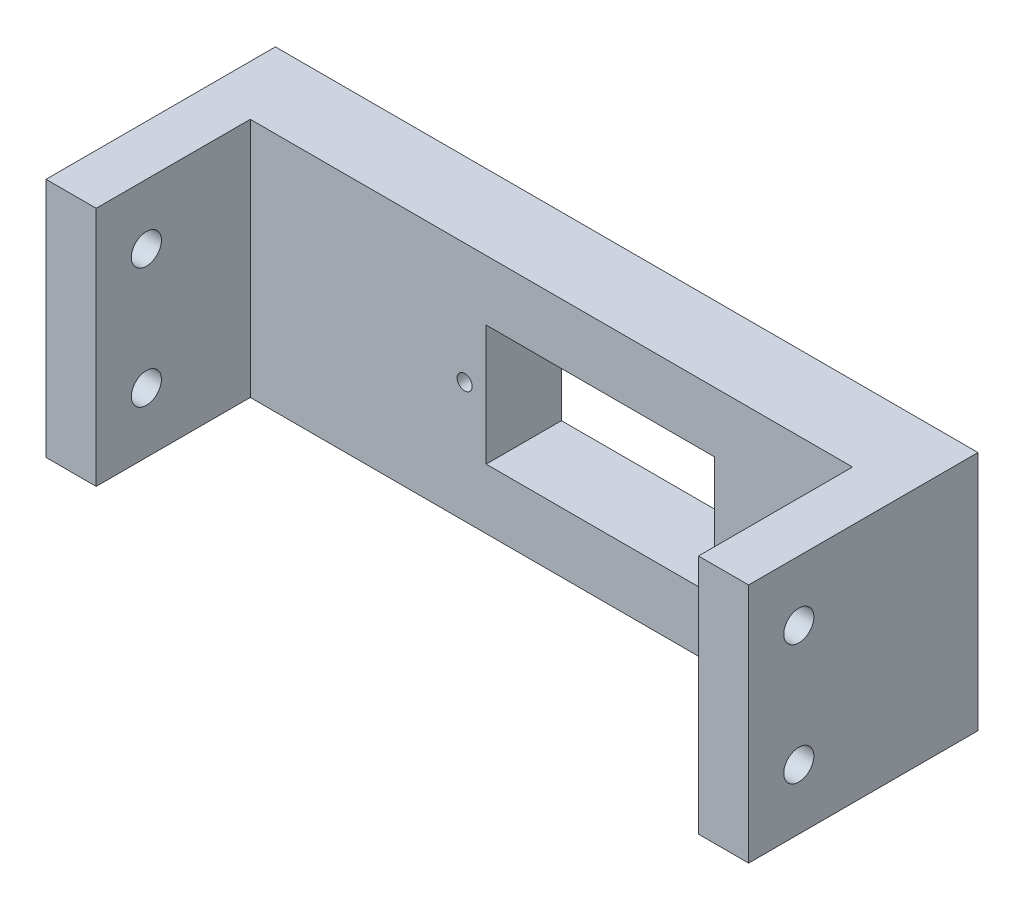
ISO-10303-21;
HEADER;
FILE_DESCRIPTION(('STEP AP214'),'2;1');
FILE_NAME('part.step','',(''),(''),'','','');
FILE_SCHEMA(('AUTOMOTIVE_DESIGN { 1 0 10303 214 1 1 1 1 }'));
ENDSEC;
DATA;
#1=APPLICATION_CONTEXT('core data for automotive mechanical design processes');
#2=APPLICATION_PROTOCOL_DEFINITION('international standard','automotive_design',2000,#1);
#3=PRODUCT_CONTEXT('',#1,'mechanical');
#4=PRODUCT('Part','Part','',(#3));
#5=PRODUCT_RELATED_PRODUCT_CATEGORY('part','',(#4));
#6=PRODUCT_DEFINITION_FORMATION('','',#4);
#7=PRODUCT_DEFINITION_CONTEXT('part definition',#1,'design');
#8=PRODUCT_DEFINITION('design','',#6,#7);
#9=PRODUCT_DEFINITION_SHAPE('','',#8);
#10=(LENGTH_UNIT() NAMED_UNIT(*) SI_UNIT(.MILLI.,.METRE.));
#11=(NAMED_UNIT(*) PLANE_ANGLE_UNIT() SI_UNIT($,.RADIAN.));
#12=(NAMED_UNIT(*) SI_UNIT($,.STERADIAN.) SOLID_ANGLE_UNIT());
#13=UNCERTAINTY_MEASURE_WITH_UNIT(LENGTH_MEASURE(1.E-05),#10,'distance_accuracy_value','');
#14=(GEOMETRIC_REPRESENTATION_CONTEXT(3) GLOBAL_UNCERTAINTY_ASSIGNED_CONTEXT((#13)) GLOBAL_UNIT_ASSIGNED_CONTEXT((#10,
#11,#12)) REPRESENTATION_CONTEXT('',''));
#15=CARTESIAN_POINT('',(0.,0.,0.));
#16=DIRECTION('',(0.,0.,1.));
#17=DIRECTION('',(1.,0.,0.));
#18=AXIS2_PLACEMENT_3D('',#15,#16,#17);
#19=CARTESIAN_POINT('',(-30.,24.,0.));
#20=DIRECTION('',(1.,0.,0.));
#21=DIRECTION('',(0.,0.,-1.));
#22=AXIS2_PLACEMENT_3D('',#19,#20,#21);
#23=PLANE('',#22);
#24=CARTESIAN_POINT('',(-30.,18.,14.1));
#25=DIRECTION('',(1.,0.,0.));
#26=DIRECTION('',(0.,0.,-1.));
#27=AXIS2_PLACEMENT_3D('',#24,#25,#26);
#28=CIRCLE('',#27,1.5);
#29=CARTESIAN_POINT('',(-30.,18.,12.6));
#30=VERTEX_POINT('',#29);
#31=EDGE_CURVE('E206',#30,#30,#28,.T.);
#32=ORIENTED_EDGE('',*,*,#31,.F.);
#33=EDGE_LOOP('',(#32));
#34=FACE_BOUND('',#33,.T.);
#35=CARTESIAN_POINT('',(-30.,6.,14.1));
#36=DIRECTION('',(1.,0.,0.));
#37=DIRECTION('',(0.,0.,-1.));
#38=AXIS2_PLACEMENT_3D('',#35,#36,#37);
#39=CIRCLE('',#38,1.5);
#40=CARTESIAN_POINT('',(-30.,6.,12.6));
#41=VERTEX_POINT('',#40);
#42=EDGE_CURVE('E198',#41,#41,#39,.T.);
#43=ORIENTED_EDGE('',*,*,#42,.F.);
#44=EDGE_LOOP('',(#43));
#45=FACE_BOUND('',#44,.T.);
#46=DIRECTION('',(0.,0.,1.));
#47=VECTOR('',#46,1.);
#48=CARTESIAN_POINT('',(-30.,0.,0.));
#49=LINE('',#48,#47);
#50=CARTESIAN_POINT('',(-30.,0.,3.74999999999998));
#51=VERTEX_POINT('',#50);
#52=CARTESIAN_POINT('',(-30.,0.,19.1));
#53=VERTEX_POINT('',#52);
#54=EDGE_CURVE('E210',#51,#53,#49,.T.);
#55=ORIENTED_EDGE('',*,*,#54,.F.);
#56=DIRECTION('',(0.,-1.,0.));
#57=VECTOR('',#56,1.);
#58=CARTESIAN_POINT('',(-30.,24.,3.74999999999998));
#59=LINE('',#58,#57);
#60=CARTESIAN_POINT('',(-30.,24.,3.74999999999998));
#61=VERTEX_POINT('',#60);
#62=EDGE_CURVE('E11',#61,#51,#59,.T.);
#63=ORIENTED_EDGE('',*,*,#62,.F.);
#64=DIRECTION('',(0.,0.,1.));
#65=VECTOR('',#64,1.);
#66=CARTESIAN_POINT('',(-30.,24.,0.));
#67=LINE('',#66,#65);
#68=CARTESIAN_POINT('',(-30.,24.,19.1));
#69=VERTEX_POINT('',#68);
#70=EDGE_CURVE('E211',#61,#69,#67,.T.);
#71=ORIENTED_EDGE('',*,*,#70,.T.);
#72=DIRECTION('',(0.,-1.,0.));
#73=VECTOR('',#72,1.);
#74=CARTESIAN_POINT('',(-30.,24.,19.1));
#75=LINE('',#74,#73);
#76=EDGE_CURVE('E240',#69,#53,#75,.T.);
#77=ORIENTED_EDGE('',*,*,#76,.T.);
#78=EDGE_LOOP('',(#55,#63,#71,#77));
#79=FACE_BOUND('',#78,.T.);
#80=ADVANCED_FACE('F43',(#34,#45,#79),#23,.T.);
#81=CARTESIAN_POINT('',(0.,24.,3.74999999999999));
#82=DIRECTION('',(0.,0.,-1.));
#83=DIRECTION('',(-1.,0.,0.));
#84=AXIS2_PLACEMENT_3D('',#81,#82,#83);
#85=PLANE('',#84);
#86=CARTESIAN_POINT('',(19.16,12.,3.74999999999999));
#87=DIRECTION('',(0.,0.,-1.));
#88=DIRECTION('',(-1.,0.,0.));
#89=AXIS2_PLACEMENT_3D('',#86,#87,#88);
#90=CIRCLE('',#89,0.750000000000002);
#91=CARTESIAN_POINT('',(18.41,12.,3.74999999999999));
#92=VERTEX_POINT('',#91);
#93=EDGE_CURVE('E389',#92,#92,#90,.T.);
#94=ORIENTED_EDGE('',*,*,#93,.T.);
#95=EDGE_LOOP('',(#94));
#96=FACE_BOUND('',#95,.T.);
#97=CARTESIAN_POINT('',(-8.64,12.,3.74999999999999));
#98=DIRECTION('',(0.,0.,-1.));
#99=DIRECTION('',(-1.,0.,0.));
#100=AXIS2_PLACEMENT_3D('',#97,#98,#99);
#101=CIRCLE('',#100,0.75);
#102=CARTESIAN_POINT('',(-9.39,12.,3.74999999999999));
#103=VERTEX_POINT('',#102);
#104=EDGE_CURVE('E391',#103,#103,#101,.T.);
#105=ORIENTED_EDGE('',*,*,#104,.T.);
#106=EDGE_LOOP('',(#105));
#107=FACE_BOUND('',#106,.T.);
#108=DIRECTION('',(1.,0.,0.));
#109=VECTOR('',#108,1.);
#110=CARTESIAN_POINT('',(-6.49999999999999,6.,3.74999999999999));
#111=LINE('',#110,#109);
#112=CARTESIAN_POINT('',(-6.5,6.,3.74999999999999));
#113=VERTEX_POINT('',#112);
#114=CARTESIAN_POINT('',(16.25,6.,3.74999999999999));
#115=VERTEX_POINT('',#114);
#116=EDGE_CURVE('E153',#113,#115,#111,.T.);
#117=ORIENTED_EDGE('',*,*,#116,.F.);
#118=DIRECTION('',(0.,-1.,0.));
#119=VECTOR('',#118,1.);
#120=CARTESIAN_POINT('',(-6.5,18.,3.74999999999999));
#121=LINE('',#120,#119);
#122=CARTESIAN_POINT('',(-6.5,18.,3.74999999999999));
#123=VERTEX_POINT('',#122);
#124=EDGE_CURVE('E133',#123,#113,#121,.T.);
#125=ORIENTED_EDGE('',*,*,#124,.F.);
#126=DIRECTION('',(-1.,0.,0.));
#127=VECTOR('',#126,1.);
#128=CARTESIAN_POINT('',(-6.49999999999999,18.,3.74999999999999));
#129=LINE('',#128,#127);
#130=CARTESIAN_POINT('',(16.25,18.,3.74999999999999));
#131=VERTEX_POINT('',#130);
#132=EDGE_CURVE('E143',#131,#123,#129,.T.);
#133=ORIENTED_EDGE('',*,*,#132,.F.);
#134=DIRECTION('',(0.,1.,0.));
#135=VECTOR('',#134,1.);
#136=CARTESIAN_POINT('',(16.25,18.,3.74999999999999));
#137=LINE('',#136,#135);
#138=EDGE_CURVE('E58',#115,#131,#137,.T.);
#139=ORIENTED_EDGE('',*,*,#138,.F.);
#140=EDGE_LOOP('',(#117,#125,#133,#139));
#141=FACE_BOUND('',#140,.T.);
#142=DIRECTION('',(1.,0.,0.));
#143=VECTOR('',#142,1.);
#144=CARTESIAN_POINT('',(0.,0.,3.74999999999999));
#145=LINE('',#144,#143);
#146=CARTESIAN_POINT('',(30.,0.,3.75));
#147=VERTEX_POINT('',#146);
#148=EDGE_CURVE('E244',#51,#147,#145,.T.);
#149=ORIENTED_EDGE('',*,*,#148,.T.);
#150=DIRECTION('',(0.,-1.,0.));
#151=VECTOR('',#150,1.);
#152=CARTESIAN_POINT('',(30.,24.,3.75));
#153=LINE('',#152,#151);
#154=CARTESIAN_POINT('',(30.,24.,3.75));
#155=VERTEX_POINT('',#154);
#156=EDGE_CURVE('E51',#155,#147,#153,.T.);
#157=ORIENTED_EDGE('',*,*,#156,.F.);
#158=DIRECTION('',(1.,0.,0.));
#159=VECTOR('',#158,1.);
#160=CARTESIAN_POINT('',(0.,24.,3.74999999999999));
#161=LINE('',#160,#159);
#162=EDGE_CURVE('E215',#61,#155,#161,.T.);
#163=ORIENTED_EDGE('',*,*,#162,.F.);
#164=ORIENTED_EDGE('',*,*,#62,.T.);
#165=EDGE_LOOP('',(#149,#157,#163,#164));
#166=FACE_BOUND('',#165,.T.);
#167=ADVANCED_FACE('F150',(#96,#107,#141,#166),#85,.F.);
#168=CARTESIAN_POINT('',(30.,24.,0.));
#169=DIRECTION('',(1.,0.,0.));
#170=DIRECTION('',(0.,0.,-1.));
#171=AXIS2_PLACEMENT_3D('',#168,#169,#170);
#172=PLANE('',#171);
#173=CARTESIAN_POINT('',(30.,18.,14.1));
#174=DIRECTION('',(1.,0.,0.));
#175=DIRECTION('',(0.,0.,-1.));
#176=AXIS2_PLACEMENT_3D('',#173,#174,#175);
#177=CIRCLE('',#176,1.5);
#178=CARTESIAN_POINT('',(30.,18.,12.6));
#179=VERTEX_POINT('',#178);
#180=EDGE_CURVE('E202',#179,#179,#177,.T.);
#181=ORIENTED_EDGE('',*,*,#180,.T.);
#182=EDGE_LOOP('',(#181));
#183=FACE_BOUND('',#182,.T.);
#184=CARTESIAN_POINT('',(30.,6.,14.1));
#185=DIRECTION('',(1.,0.,0.));
#186=DIRECTION('',(0.,0.,-1.));
#187=AXIS2_PLACEMENT_3D('',#184,#185,#186);
#188=CIRCLE('',#187,1.5);
#189=CARTESIAN_POINT('',(30.,6.,12.6));
#190=VERTEX_POINT('',#189);
#191=EDGE_CURVE('E183',#190,#190,#188,.T.);
#192=ORIENTED_EDGE('',*,*,#191,.T.);
#193=EDGE_LOOP('',(#192));
#194=FACE_BOUND('',#193,.T.);
#195=DIRECTION('',(0.,0.,1.));
#196=VECTOR('',#195,1.);
#197=CARTESIAN_POINT('',(30.,0.,0.));
#198=LINE('',#197,#196);
#199=CARTESIAN_POINT('',(30.,0.,19.1));
#200=VERTEX_POINT('',#199);
#201=EDGE_CURVE('E247',#147,#200,#198,.T.);
#202=ORIENTED_EDGE('',*,*,#201,.T.);
#203=DIRECTION('',(0.,-1.,0.));
#204=VECTOR('',#203,1.);
#205=CARTESIAN_POINT('',(30.,24.,19.1));
#206=LINE('',#205,#204);
#207=CARTESIAN_POINT('',(30.,24.,19.1));
#208=VERTEX_POINT('',#207);
#209=EDGE_CURVE('E284',#208,#200,#206,.T.);
#210=ORIENTED_EDGE('',*,*,#209,.F.);
#211=DIRECTION('',(0.,0.,1.));
#212=VECTOR('',#211,1.);
#213=CARTESIAN_POINT('',(30.,24.,0.));
#214=LINE('',#213,#212);
#215=EDGE_CURVE('E219',#155,#208,#214,.T.);
#216=ORIENTED_EDGE('',*,*,#215,.F.);
#217=ORIENTED_EDGE('',*,*,#156,.T.);
#218=EDGE_LOOP('',(#202,#210,#216,#217));
#219=FACE_BOUND('',#218,.T.);
#220=ADVANCED_FACE('F292',(#183,#194,#219),#172,.F.);
#221=CARTESIAN_POINT('',(0.,24.,19.1));
#222=DIRECTION('',(0.,0.,1.));
#223=DIRECTION('',(1.,0.,0.));
#224=AXIS2_PLACEMENT_3D('',#221,#222,#223);
#225=PLANE('',#224);
#226=DIRECTION('',(-1.,0.,0.));
#227=VECTOR('',#226,1.);
#228=CARTESIAN_POINT('',(0.,0.,19.1));
#229=LINE('',#228,#227);
#230=CARTESIAN_POINT('',(35.,0.,19.1));
#231=VERTEX_POINT('',#230);
#232=EDGE_CURVE('E251',#231,#200,#229,.T.);
#233=ORIENTED_EDGE('',*,*,#232,.F.);
#234=DIRECTION('',(0.,-1.,0.));
#235=VECTOR('',#234,1.);
#236=CARTESIAN_POINT('',(35.,24.,19.1));
#237=LINE('',#236,#235);
#238=CARTESIAN_POINT('',(35.,24.,19.1));
#239=VERTEX_POINT('',#238);
#240=EDGE_CURVE('E281',#239,#231,#237,.T.);
#241=ORIENTED_EDGE('',*,*,#240,.F.);
#242=DIRECTION('',(-1.,0.,0.));
#243=VECTOR('',#242,1.);
#244=CARTESIAN_POINT('',(0.,24.,19.1));
#245=LINE('',#244,#243);
#246=EDGE_CURVE('E222',#239,#208,#245,.T.);
#247=ORIENTED_EDGE('',*,*,#246,.T.);
#248=ORIENTED_EDGE('',*,*,#209,.T.);
#249=EDGE_LOOP('',(#233,#241,#247,#248));
#250=FACE_BOUND('',#249,.T.);
#251=ADVANCED_FACE('F302',(#250),#225,.T.);
#252=CARTESIAN_POINT('',(35.,24.,0.));
#253=DIRECTION('',(1.,0.,0.));
#254=DIRECTION('',(0.,0.,-1.));
#255=AXIS2_PLACEMENT_3D('',#252,#253,#254);
#256=PLANE('',#255);
#257=CARTESIAN_POINT('',(35.,18.,14.1));
#258=DIRECTION('',(-1.,0.,0.));
#259=DIRECTION('',(0.,0.,1.));
#260=AXIS2_PLACEMENT_3D('',#257,#258,#259);
#261=CIRCLE('',#260,1.5);
#262=CARTESIAN_POINT('',(35.,18.,15.6));
#263=VERTEX_POINT('',#262);
#264=EDGE_CURVE('E179',#263,#263,#261,.T.);
#265=ORIENTED_EDGE('',*,*,#264,.T.);
#266=EDGE_LOOP('',(#265));
#267=FACE_BOUND('',#266,.T.);
#268=CARTESIAN_POINT('',(35.,6.,14.1));
#269=DIRECTION('',(-1.,0.,0.));
#270=DIRECTION('',(0.,0.,1.));
#271=AXIS2_PLACEMENT_3D('',#268,#269,#270);
#272=CIRCLE('',#271,1.5);
#273=CARTESIAN_POINT('',(35.,6.,15.6));
#274=VERTEX_POINT('',#273);
#275=EDGE_CURVE('E188',#274,#274,#272,.T.);
#276=ORIENTED_EDGE('',*,*,#275,.T.);
#277=EDGE_LOOP('',(#276));
#278=FACE_BOUND('',#277,.T.);
#279=DIRECTION('',(0.,0.,1.));
#280=VECTOR('',#279,1.);
#281=CARTESIAN_POINT('',(35.,0.,0.));
#282=LINE('',#281,#280);
#283=CARTESIAN_POINT('',(35.,0.,-3.75));
#284=VERTEX_POINT('',#283);
#285=EDGE_CURVE('E255',#284,#231,#282,.T.);
#286=ORIENTED_EDGE('',*,*,#285,.F.);
#287=DIRECTION('',(0.,-1.,0.));
#288=VECTOR('',#287,1.);
#289=CARTESIAN_POINT('',(35.,24.,-3.75));
#290=LINE('',#289,#288);
#291=CARTESIAN_POINT('',(35.,24.,-3.75));
#292=VERTEX_POINT('',#291);
#293=EDGE_CURVE('E278',#292,#284,#290,.T.);
#294=ORIENTED_EDGE('',*,*,#293,.F.);
#295=DIRECTION('',(0.,0.,1.));
#296=VECTOR('',#295,1.);
#297=CARTESIAN_POINT('',(35.,24.,0.));
#298=LINE('',#297,#296);
#299=EDGE_CURVE('E226',#292,#239,#298,.T.);
#300=ORIENTED_EDGE('',*,*,#299,.T.);
#301=ORIENTED_EDGE('',*,*,#240,.T.);
#302=EDGE_LOOP('',(#286,#294,#300,#301));
#303=FACE_BOUND('',#302,.T.);
#304=ADVANCED_FACE('F310',(#267,#278,#303),#256,.T.);
#305=CARTESIAN_POINT('',(0.,24.,-3.74999999999999));
#306=DIRECTION('',(0.,0.,-1.));
#307=DIRECTION('',(-1.,0.,0.));
#308=AXIS2_PLACEMENT_3D('',#305,#306,#307);
#309=PLANE('',#308);
#310=CARTESIAN_POINT('',(19.16,12.,-3.75));
#311=DIRECTION('',(0.,0.,-1.));
#312=DIRECTION('',(-1.,0.,0.));
#313=AXIS2_PLACEMENT_3D('',#310,#311,#312);
#314=CIRCLE('',#313,0.750000000000002);
#315=CARTESIAN_POINT('',(18.41,12.,-3.74999999999999));
#316=VERTEX_POINT('',#315);
#317=EDGE_CURVE('E387',#316,#316,#314,.T.);
#318=ORIENTED_EDGE('',*,*,#317,.F.);
#319=EDGE_LOOP('',(#318));
#320=FACE_BOUND('',#319,.T.);
#321=CARTESIAN_POINT('',(-8.64,12.,-3.74999999999999));
#322=DIRECTION('',(0.,0.,-1.));
#323=DIRECTION('',(-1.,0.,0.));
#324=AXIS2_PLACEMENT_3D('',#321,#322,#323);
#325=CIRCLE('',#324,0.75);
#326=CARTESIAN_POINT('',(-9.39,12.,-3.74999999999999));
#327=VERTEX_POINT('',#326);
#328=EDGE_CURVE('E398',#327,#327,#325,.T.);
#329=ORIENTED_EDGE('',*,*,#328,.F.);
#330=EDGE_LOOP('',(#329));
#331=FACE_BOUND('',#330,.T.);
#332=DIRECTION('',(0.,1.,0.));
#333=VECTOR('',#332,1.);
#334=CARTESIAN_POINT('',(-6.5,18.,-3.74999999999999));
#335=LINE('',#334,#333);
#336=CARTESIAN_POINT('',(-6.5,6.,-3.74999999999999));
#337=VERTEX_POINT('',#336);
#338=CARTESIAN_POINT('',(-6.5,18.,-3.74999999999999));
#339=VERTEX_POINT('',#338);
#340=EDGE_CURVE('E66',#337,#339,#335,.T.);
#341=ORIENTED_EDGE('',*,*,#340,.F.);
#342=DIRECTION('',(-1.,0.,0.));
#343=VECTOR('',#342,1.);
#344=CARTESIAN_POINT('',(-6.5,6.,-3.74999999999999));
#345=LINE('',#344,#343);
#346=CARTESIAN_POINT('',(16.25,6.,-3.74999999999999));
#347=VERTEX_POINT('',#346);
#348=EDGE_CURVE('E140',#347,#337,#345,.T.);
#349=ORIENTED_EDGE('',*,*,#348,.F.);
#350=DIRECTION('',(0.,-1.,0.));
#351=VECTOR('',#350,1.);
#352=CARTESIAN_POINT('',(16.25,18.,-3.74999999999999));
#353=LINE('',#352,#351);
#354=CARTESIAN_POINT('',(16.25,18.,-3.74999999999999));
#355=VERTEX_POINT('',#354);
#356=EDGE_CURVE('E165',#355,#347,#353,.T.);
#357=ORIENTED_EDGE('',*,*,#356,.F.);
#358=DIRECTION('',(1.,0.,0.));
#359=VECTOR('',#358,1.);
#360=CARTESIAN_POINT('',(-6.5,18.,-3.74999999999999));
#361=LINE('',#360,#359);
#362=EDGE_CURVE('E158',#339,#355,#361,.T.);
#363=ORIENTED_EDGE('',*,*,#362,.F.);
#364=EDGE_LOOP('',(#341,#349,#357,#363));
#365=FACE_BOUND('',#364,.T.);
#366=DIRECTION('',(1.,0.,0.));
#367=VECTOR('',#366,1.);
#368=CARTESIAN_POINT('',(0.,0.,-3.74999999999999));
#369=LINE('',#368,#367);
#370=CARTESIAN_POINT('',(-35.,0.,-3.74999999999998));
#371=VERTEX_POINT('',#370);
#372=EDGE_CURVE('E259',#371,#284,#369,.T.);
#373=ORIENTED_EDGE('',*,*,#372,.F.);
#374=DIRECTION('',(0.,-1.,0.));
#375=VECTOR('',#374,1.);
#376=CARTESIAN_POINT('',(-35.,24.,-3.74999999999998));
#377=LINE('',#376,#375);
#378=CARTESIAN_POINT('',(-35.,24.,-3.74999999999998));
#379=VERTEX_POINT('',#378);
#380=EDGE_CURVE('E275',#379,#371,#377,.T.);
#381=ORIENTED_EDGE('',*,*,#380,.F.);
#382=DIRECTION('',(1.,0.,0.));
#383=VECTOR('',#382,1.);
#384=CARTESIAN_POINT('',(0.,24.,-3.74999999999999));
#385=LINE('',#384,#383);
#386=EDGE_CURVE('E230',#379,#292,#385,.T.);
#387=ORIENTED_EDGE('',*,*,#386,.T.);
#388=ORIENTED_EDGE('',*,*,#293,.T.);
#389=EDGE_LOOP('',(#373,#381,#387,#388));
#390=FACE_BOUND('',#389,.T.);
#391=ADVANCED_FACE('F313',(#320,#331,#365,#390),#309,.T.);
#392=CARTESIAN_POINT('',(-35.,24.,0.));
#393=DIRECTION('',(1.,0.,0.));
#394=DIRECTION('',(0.,0.,-1.));
#395=AXIS2_PLACEMENT_3D('',#392,#393,#394);
#396=PLANE('',#395);
#397=CARTESIAN_POINT('',(-35.,18.,14.1));
#398=DIRECTION('',(-1.,0.,0.));
#399=DIRECTION('',(0.,0.,1.));
#400=AXIS2_PLACEMENT_3D('',#397,#398,#399);
#401=CIRCLE('',#400,1.5);
#402=CARTESIAN_POINT('',(-35.,18.,15.6));
#403=VERTEX_POINT('',#402);
#404=EDGE_CURVE('E184',#403,#403,#401,.T.);
#405=ORIENTED_EDGE('',*,*,#404,.F.);
#406=EDGE_LOOP('',(#405));
#407=FACE_BOUND('',#406,.T.);
#408=CARTESIAN_POINT('',(-35.,6.,14.1));
#409=DIRECTION('',(-1.,0.,0.));
#410=DIRECTION('',(0.,0.,1.));
#411=AXIS2_PLACEMENT_3D('',#408,#409,#410);
#412=CIRCLE('',#411,1.5);
#413=CARTESIAN_POINT('',(-35.,6.,15.6));
#414=VERTEX_POINT('',#413);
#415=EDGE_CURVE('E147',#414,#414,#412,.T.);
#416=ORIENTED_EDGE('',*,*,#415,.F.);
#417=EDGE_LOOP('',(#416));
#418=FACE_BOUND('',#417,.T.);
#419=DIRECTION('',(0.,0.,1.));
#420=VECTOR('',#419,1.);
#421=CARTESIAN_POINT('',(-35.,0.,0.));
#422=LINE('',#421,#420);
#423=CARTESIAN_POINT('',(-35.,0.,19.1));
#424=VERTEX_POINT('',#423);
#425=EDGE_CURVE('E263',#371,#424,#422,.T.);
#426=ORIENTED_EDGE('',*,*,#425,.T.);
#427=DIRECTION('',(0.,-1.,0.));
#428=VECTOR('',#427,1.);
#429=CARTESIAN_POINT('',(-35.,24.,19.1));
#430=LINE('',#429,#428);
#431=CARTESIAN_POINT('',(-35.,24.,19.1));
#432=VERTEX_POINT('',#431);
#433=EDGE_CURVE('E271',#432,#424,#430,.T.);
#434=ORIENTED_EDGE('',*,*,#433,.F.);
#435=DIRECTION('',(0.,0.,1.));
#436=VECTOR('',#435,1.);
#437=CARTESIAN_POINT('',(-35.,24.,0.));
#438=LINE('',#437,#436);
#439=EDGE_CURVE('E234',#379,#432,#438,.T.);
#440=ORIENTED_EDGE('',*,*,#439,.F.);
#441=ORIENTED_EDGE('',*,*,#380,.T.);
#442=EDGE_LOOP('',(#426,#434,#440,#441));
#443=FACE_BOUND('',#442,.T.);
#444=ADVANCED_FACE('F319',(#407,#418,#443),#396,.F.);
#445=CARTESIAN_POINT('',(0.,24.,19.1));
#446=DIRECTION('',(0.,0.,-1.));
#447=DIRECTION('',(-1.,0.,0.));
#448=AXIS2_PLACEMENT_3D('',#445,#446,#447);
#449=PLANE('',#448);
#450=DIRECTION('',(1.,0.,0.));
#451=VECTOR('',#450,1.);
#452=CARTESIAN_POINT('',(0.,0.,19.1));
#453=LINE('',#452,#451);
#454=EDGE_CURVE('E216',#424,#53,#453,.T.);
#455=ORIENTED_EDGE('',*,*,#454,.T.);
#456=ORIENTED_EDGE('',*,*,#76,.F.);
#457=DIRECTION('',(1.,0.,0.));
#458=VECTOR('',#457,1.);
#459=CARTESIAN_POINT('',(0.,24.,19.1));
#460=LINE('',#459,#458);
#461=EDGE_CURVE('E237',#432,#69,#460,.T.);
#462=ORIENTED_EDGE('',*,*,#461,.F.);
#463=ORIENTED_EDGE('',*,*,#433,.T.);
#464=EDGE_LOOP('',(#455,#456,#462,#463));
#465=FACE_BOUND('',#464,.T.);
#466=ADVANCED_FACE('F323',(#465),#449,.F.);
#467=CARTESIAN_POINT('',(0.,24.,0.));
#468=DIRECTION('',(0.,1.,0.));
#469=DIRECTION('',(0.,0.,1.));
#470=AXIS2_PLACEMENT_3D('',#467,#468,#469);
#471=PLANE('',#470);
#472=ORIENTED_EDGE('',*,*,#70,.F.);
#473=ORIENTED_EDGE('',*,*,#162,.T.);
#474=ORIENTED_EDGE('',*,*,#215,.T.);
#475=ORIENTED_EDGE('',*,*,#246,.F.);
#476=ORIENTED_EDGE('',*,*,#299,.F.);
#477=ORIENTED_EDGE('',*,*,#386,.F.);
#478=ORIENTED_EDGE('',*,*,#439,.T.);
#479=ORIENTED_EDGE('',*,*,#461,.T.);
#480=EDGE_LOOP('',(#472,#473,#474,#475,#476,#477,#478,#479));
#481=FACE_BOUND('',#480,.T.);
#482=ADVANCED_FACE('F307',(#481),#471,.T.);
#483=CARTESIAN_POINT('',(0.,0.,0.));
#484=DIRECTION('',(0.,1.,0.));
#485=DIRECTION('',(0.,0.,1.));
#486=AXIS2_PLACEMENT_3D('',#483,#484,#485);
#487=PLANE('',#486);
#488=ORIENTED_EDGE('',*,*,#54,.T.);
#489=ORIENTED_EDGE('',*,*,#454,.F.);
#490=ORIENTED_EDGE('',*,*,#425,.F.);
#491=ORIENTED_EDGE('',*,*,#372,.T.);
#492=ORIENTED_EDGE('',*,*,#285,.T.);
#493=ORIENTED_EDGE('',*,*,#232,.T.);
#494=ORIENTED_EDGE('',*,*,#201,.F.);
#495=ORIENTED_EDGE('',*,*,#148,.F.);
#496=EDGE_LOOP('',(#488,#489,#490,#491,#492,#493,#494,#495));
#497=FACE_BOUND('',#496,.T.);
#498=ADVANCED_FACE('F297',(#497),#487,.F.);
#499=CARTESIAN_POINT('',(35.,6.,14.1));
#500=DIRECTION('',(-1.,0.,0.));
#501=DIRECTION('',(0.,0.,1.));
#502=AXIS2_PLACEMENT_3D('',#499,#500,#501);
#503=CYLINDRICAL_SURFACE('',#502,1.5);
#504=ORIENTED_EDGE('',*,*,#42,.T.);
#505=EDGE_LOOP('',(#504));
#506=FACE_BOUND('',#505,.T.);
#507=ORIENTED_EDGE('',*,*,#415,.T.);
#508=EDGE_LOOP('',(#507));
#509=FACE_BOUND('',#508,.T.);
#510=ADVANCED_FACE('F352',(#506,#509),#503,.F.);
#511=CARTESIAN_POINT('',(35.,18.,14.1));
#512=DIRECTION('',(-1.,0.,0.));
#513=DIRECTION('',(0.,0.,1.));
#514=AXIS2_PLACEMENT_3D('',#511,#512,#513);
#515=CYLINDRICAL_SURFACE('',#514,1.5);
#516=ORIENTED_EDGE('',*,*,#31,.T.);
#517=EDGE_LOOP('',(#516));
#518=FACE_BOUND('',#517,.T.);
#519=ORIENTED_EDGE('',*,*,#404,.T.);
#520=EDGE_LOOP('',(#519));
#521=FACE_BOUND('',#520,.T.);
#522=ADVANCED_FACE('F357',(#518,#521),#515,.F.);
#523=ORIENTED_EDGE('',*,*,#275,.F.);
#524=EDGE_LOOP('',(#523));
#525=FACE_BOUND('',#524,.T.);
#526=ORIENTED_EDGE('',*,*,#191,.F.);
#527=EDGE_LOOP('',(#526));
#528=FACE_BOUND('',#527,.T.);
#529=ADVANCED_FACE('F359',(#525,#528),#503,.F.);
#530=ORIENTED_EDGE('',*,*,#264,.F.);
#531=EDGE_LOOP('',(#530));
#532=FACE_BOUND('',#531,.T.);
#533=ORIENTED_EDGE('',*,*,#180,.F.);
#534=EDGE_LOOP('',(#533));
#535=FACE_BOUND('',#534,.T.);
#536=ADVANCED_FACE('F363',(#532,#535),#515,.F.);
#537=CARTESIAN_POINT('',(-6.49999999999999,18.,19.101));
#538=DIRECTION('',(-1.,0.,0.));
#539=DIRECTION('',(0.,0.,1.));
#540=AXIS2_PLACEMENT_3D('',#537,#538,#539);
#541=PLANE('',#540);
#542=ORIENTED_EDGE('',*,*,#124,.T.);
#543=DIRECTION('',(0.,0.,-1.));
#544=VECTOR('',#543,1.);
#545=CARTESIAN_POINT('',(-6.49999999999999,6.,19.101));
#546=LINE('',#545,#544);
#547=EDGE_CURVE('E148',#113,#337,#546,.T.);
#548=ORIENTED_EDGE('',*,*,#547,.T.);
#549=ORIENTED_EDGE('',*,*,#340,.T.);
#550=DIRECTION('',(0.,0.,-1.));
#551=VECTOR('',#550,1.);
#552=CARTESIAN_POINT('',(-6.49999999999999,18.,19.101));
#553=LINE('',#552,#551);
#554=EDGE_CURVE('E129',#123,#339,#553,.T.);
#555=ORIENTED_EDGE('',*,*,#554,.F.);
#556=EDGE_LOOP('',(#542,#548,#549,#555));
#557=FACE_BOUND('',#556,.T.);
#558=ADVANCED_FACE('F131',(#557),#541,.F.);
#559=CARTESIAN_POINT('',(-6.49999999999999,6.,19.101));
#560=DIRECTION('',(0.,-1.,0.));
#561=DIRECTION('',(1.,0.,0.));
#562=AXIS2_PLACEMENT_3D('',#559,#560,#561);
#563=PLANE('',#562);
#564=ORIENTED_EDGE('',*,*,#116,.T.);
#565=DIRECTION('',(0.,0.,-1.));
#566=VECTOR('',#565,1.);
#567=CARTESIAN_POINT('',(16.25,6.,19.101));
#568=LINE('',#567,#566);
#569=EDGE_CURVE('E174',#115,#347,#568,.T.);
#570=ORIENTED_EDGE('',*,*,#569,.T.);
#571=ORIENTED_EDGE('',*,*,#348,.T.);
#572=ORIENTED_EDGE('',*,*,#547,.F.);
#573=EDGE_LOOP('',(#564,#570,#571,#572));
#574=FACE_BOUND('',#573,.T.);
#575=ADVANCED_FACE('F366',(#574),#563,.F.);
#576=CARTESIAN_POINT('',(16.25,18.,19.101));
#577=DIRECTION('',(1.,0.,0.));
#578=DIRECTION('',(0.,0.,-1.));
#579=AXIS2_PLACEMENT_3D('',#576,#577,#578);
#580=PLANE('',#579);
#581=ORIENTED_EDGE('',*,*,#138,.T.);
#582=DIRECTION('',(0.,0.,-1.));
#583=VECTOR('',#582,1.);
#584=CARTESIAN_POINT('',(16.25,18.,19.101));
#585=LINE('',#584,#583);
#586=EDGE_CURVE('E139',#131,#355,#585,.T.);
#587=ORIENTED_EDGE('',*,*,#586,.T.);
#588=ORIENTED_EDGE('',*,*,#356,.T.);
#589=ORIENTED_EDGE('',*,*,#569,.F.);
#590=EDGE_LOOP('',(#581,#587,#588,#589));
#591=FACE_BOUND('',#590,.T.);
#592=ADVANCED_FACE('F370',(#591),#580,.F.);
#593=CARTESIAN_POINT('',(-6.49999999999999,18.,19.101));
#594=DIRECTION('',(0.,1.,0.));
#595=DIRECTION('',(-1.,0.,0.));
#596=AXIS2_PLACEMENT_3D('',#593,#594,#595);
#597=PLANE('',#596);
#598=ORIENTED_EDGE('',*,*,#132,.T.);
#599=ORIENTED_EDGE('',*,*,#554,.T.);
#600=ORIENTED_EDGE('',*,*,#362,.T.);
#601=ORIENTED_EDGE('',*,*,#586,.F.);
#602=EDGE_LOOP('',(#598,#599,#600,#601));
#603=FACE_BOUND('',#602,.T.);
#604=ADVANCED_FACE('F144',(#603),#597,.F.);
#605=CARTESIAN_POINT('',(-8.63999999999999,12.,19.1));
#606=DIRECTION('',(0.,0.,-1.));
#607=DIRECTION('',(-1.,0.,0.));
#608=AXIS2_PLACEMENT_3D('',#605,#606,#607);
#609=CYLINDRICAL_SURFACE('',#608,0.75);
#610=ORIENTED_EDGE('',*,*,#328,.T.);
#611=EDGE_LOOP('',(#610));
#612=FACE_BOUND('',#611,.T.);
#613=ORIENTED_EDGE('',*,*,#104,.F.);
#614=EDGE_LOOP('',(#613));
#615=FACE_BOUND('',#614,.T.);
#616=ADVANCED_FACE('F369',(#612,#615),#609,.F.);
#617=CARTESIAN_POINT('',(19.16,12.,19.1));
#618=DIRECTION('',(0.,0.,-1.));
#619=DIRECTION('',(-1.,0.,0.));
#620=AXIS2_PLACEMENT_3D('',#617,#618,#619);
#621=CYLINDRICAL_SURFACE('',#620,0.750000000000002);
#622=ORIENTED_EDGE('',*,*,#317,.T.);
#623=EDGE_LOOP('',(#622));
#624=FACE_BOUND('',#623,.T.);
#625=ORIENTED_EDGE('',*,*,#93,.F.);
#626=EDGE_LOOP('',(#625));
#627=FACE_BOUND('',#626,.T.);
#628=ADVANCED_FACE('F378',(#624,#627),#621,.F.);
#629=CLOSED_SHELL('',(#80,#167,#220,#251,#304,#391,#444,#466,#482,#498,#510,#522,#529,#536,#558,
#575,#592,#604,#616,#628));
#630=MANIFOLD_SOLID_BREP('B2',#629);
#631=ADVANCED_BREP_SHAPE_REPRESENTATION('',(#18,#630),#14);
#632=SHAPE_DEFINITION_REPRESENTATION(#9,#631);
ENDSEC;
END-ISO-10303-21;
